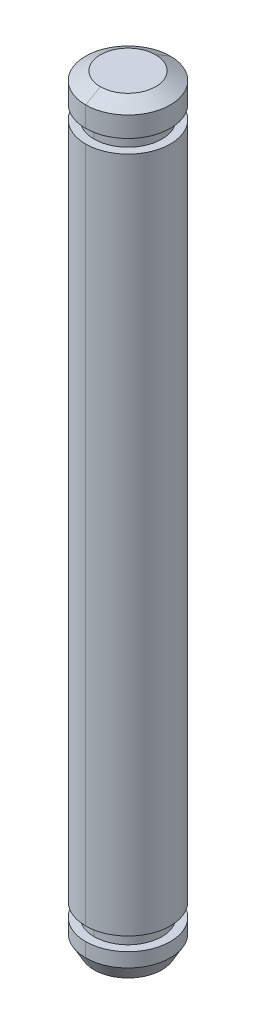
ISO-10303-21;
HEADER;
FILE_DESCRIPTION(('STEP AP214'),'2;1');
FILE_NAME('part.step','',(''),(''),'','','');
FILE_SCHEMA(('AUTOMOTIVE_DESIGN { 1 0 10303 214 1 1 1 1 }'));
ENDSEC;
DATA;
#1=APPLICATION_CONTEXT('core data for automotive mechanical design processes');
#2=APPLICATION_PROTOCOL_DEFINITION('international standard','automotive_design',2000,#1);
#3=PRODUCT_CONTEXT('',#1,'mechanical');
#4=PRODUCT('Part','Part','',(#3));
#5=PRODUCT_RELATED_PRODUCT_CATEGORY('part','',(#4));
#6=PRODUCT_DEFINITION_FORMATION('','',#4);
#7=PRODUCT_DEFINITION_CONTEXT('part definition',#1,'design');
#8=PRODUCT_DEFINITION('design','',#6,#7);
#9=PRODUCT_DEFINITION_SHAPE('','',#8);
#10=(LENGTH_UNIT() NAMED_UNIT(*) SI_UNIT(.MILLI.,.METRE.));
#11=(NAMED_UNIT(*) PLANE_ANGLE_UNIT() SI_UNIT($,.RADIAN.));
#12=(NAMED_UNIT(*) SI_UNIT($,.STERADIAN.) SOLID_ANGLE_UNIT());
#13=UNCERTAINTY_MEASURE_WITH_UNIT(LENGTH_MEASURE(1.E-05),#10,'distance_accuracy_value','');
#14=(GEOMETRIC_REPRESENTATION_CONTEXT(3) GLOBAL_UNCERTAINTY_ASSIGNED_CONTEXT((#13)) GLOBAL_UNIT_ASSIGNED_CONTEXT((#10,
#11,#12)) REPRESENTATION_CONTEXT('',''));
#15=CARTESIAN_POINT('',(0.,0.,0.));
#16=DIRECTION('',(0.,0.,1.));
#17=DIRECTION('',(1.,0.,0.));
#18=AXIS2_PLACEMENT_3D('',#15,#16,#17);
#19=CARTESIAN_POINT('',(0.,-21.6339745962154,0.));
#20=DIRECTION('',(0.,1.,0.));
#21=DIRECTION('',(0.,0.,1.));
#22=AXIS2_PLACEMENT_3D('',#19,#20,#21);
#23=CONICAL_SURFACE('',#22,2.5,0.523598775598306);
#24=DIRECTION('',(0.,0.866025403784435,-0.500000000000006));
#25=VECTOR('',#24,1.);
#26=CARTESIAN_POINT('',(0.,-21.6339745962154,-2.5));
#27=LINE('',#26,#25);
#28=CARTESIAN_POINT('',(0.,-22.5,-1.99999999999992));
#29=VERTEX_POINT('',#28);
#30=CARTESIAN_POINT('',(0.,-21.6339745962154,-2.5));
#31=VERTEX_POINT('',#30);
#32=EDGE_CURVE('E222',#29,#31,#27,.T.);
#33=ORIENTED_EDGE('',*,*,#32,.F.);
#34=CARTESIAN_POINT('',(0.,-22.5,0.));
#35=DIRECTION('',(0.,-1.,0.));
#36=DIRECTION('',(0.,0.,-1.));
#37=AXIS2_PLACEMENT_3D('',#34,#35,#36);
#38=CIRCLE('',#37,1.99999999999992);
#39=CARTESIAN_POINT('',(0.,-22.5,1.99999999999992));
#40=VERTEX_POINT('',#39);
#41=EDGE_CURVE('E28',#40,#29,#38,.T.);
#42=ORIENTED_EDGE('',*,*,#41,.F.);
#43=DIRECTION('',(0.,0.866025403784435,0.500000000000006));
#44=VECTOR('',#43,1.);
#45=CARTESIAN_POINT('',(0.,-21.6339745962154,2.5));
#46=LINE('',#45,#44);
#47=CARTESIAN_POINT('',(0.,-21.6339745962154,2.5));
#48=VERTEX_POINT('',#47);
#49=EDGE_CURVE('E181',#40,#48,#46,.T.);
#50=ORIENTED_EDGE('',*,*,#49,.T.);
#51=CARTESIAN_POINT('',(0.,-21.6339745962154,0.));
#52=DIRECTION('',(0.,1.,0.));
#53=DIRECTION('',(0.,0.,-1.));
#54=AXIS2_PLACEMENT_3D('',#51,#52,#53);
#55=CIRCLE('',#54,2.5);
#56=EDGE_CURVE('E11',#31,#48,#55,.T.);
#57=ORIENTED_EDGE('',*,*,#56,.F.);
#58=EDGE_LOOP('',(#33,#42,#50,#57));
#59=FACE_BOUND('',#58,.T.);
#60=ADVANCED_FACE('F17',(#59),#23,.T.);
#61=CARTESIAN_POINT('',(0.,22.5,0.));
#62=DIRECTION('',(0.,-1.,0.));
#63=DIRECTION('',(0.,0.,-1.));
#64=AXIS2_PLACEMENT_3D('',#61,#62,#63);
#65=CONICAL_SURFACE('',#64,1.63397459621556,1.0471975511966);
#66=DIRECTION('',(0.,-0.5,0.866025403784437));
#67=VECTOR('',#66,1.);
#68=CARTESIAN_POINT('',(0.,22.5,1.63397459621556));
#69=LINE('',#68,#67);
#70=CARTESIAN_POINT('',(0.,22.5,1.63397459621556));
#71=VERTEX_POINT('',#70);
#72=CARTESIAN_POINT('',(0.,22.,2.5));
#73=VERTEX_POINT('',#72);
#74=EDGE_CURVE('E143',#71,#73,#69,.T.);
#75=ORIENTED_EDGE('',*,*,#74,.F.);
#76=CARTESIAN_POINT('',(0.,22.5,0.));
#77=DIRECTION('',(0.,1.,0.));
#78=DIRECTION('',(0.,0.,1.));
#79=AXIS2_PLACEMENT_3D('',#76,#77,#78);
#80=CIRCLE('',#79,1.63397459621556);
#81=CARTESIAN_POINT('',(0.,22.5,-1.63397459621556));
#82=VERTEX_POINT('',#81);
#83=EDGE_CURVE('E230',#82,#71,#80,.T.);
#84=ORIENTED_EDGE('',*,*,#83,.F.);
#85=DIRECTION('',(0.,-0.5,-0.866025403784437));
#86=VECTOR('',#85,1.);
#87=CARTESIAN_POINT('',(0.,22.5,-1.63397459621556));
#88=LINE('',#87,#86);
#89=CARTESIAN_POINT('',(0.,22.,-2.5));
#90=VERTEX_POINT('',#89);
#91=EDGE_CURVE('E146',#82,#90,#88,.T.);
#92=ORIENTED_EDGE('',*,*,#91,.T.);
#93=CARTESIAN_POINT('',(0.,22.,0.));
#94=DIRECTION('',(0.,-1.,0.));
#95=DIRECTION('',(0.,0.,1.));
#96=AXIS2_PLACEMENT_3D('',#93,#94,#95);
#97=CIRCLE('',#96,2.5);
#98=EDGE_CURVE('E139',#73,#90,#97,.T.);
#99=ORIENTED_EDGE('',*,*,#98,.F.);
#100=EDGE_LOOP('',(#75,#84,#92,#99));
#101=FACE_BOUND('',#100,.T.);
#102=ADVANCED_FACE('F141',(#101),#65,.T.);
#103=CARTESIAN_POINT('',(0.,22.5,0.));
#104=DIRECTION('',(0.,-1.,0.));
#105=DIRECTION('',(0.,0.,-1.));
#106=AXIS2_PLACEMENT_3D('',#103,#104,#105);
#107=CYLINDRICAL_SURFACE('',#106,2.5);
#108=DIRECTION('',(0.,-1.,0.));
#109=VECTOR('',#108,1.);
#110=CARTESIAN_POINT('',(0.,22.5,2.5));
#111=LINE('',#110,#109);
#112=CARTESIAN_POINT('',(0.,-20.8,2.5));
#113=VERTEX_POINT('',#112);
#114=EDGE_CURVE('E208',#113,#48,#111,.T.);
#115=ORIENTED_EDGE('',*,*,#114,.F.);
#116=CARTESIAN_POINT('',(0.,-20.8,0.));
#117=DIRECTION('',(0.,1.,0.));
#118=DIRECTION('',(0.,0.,1.));
#119=AXIS2_PLACEMENT_3D('',#116,#117,#118);
#120=CIRCLE('',#119,2.5);
#121=CARTESIAN_POINT('',(0.,-20.8,-2.5));
#122=VERTEX_POINT('',#121);
#123=EDGE_CURVE('E233',#122,#113,#120,.T.);
#124=ORIENTED_EDGE('',*,*,#123,.F.);
#125=DIRECTION('',(0.,-1.,0.));
#126=VECTOR('',#125,1.);
#127=CARTESIAN_POINT('',(0.,22.5,-2.5));
#128=LINE('',#127,#126);
#129=EDGE_CURVE('E216',#122,#31,#128,.T.);
#130=ORIENTED_EDGE('',*,*,#129,.T.);
#131=ORIENTED_EDGE('',*,*,#56,.T.);
#132=EDGE_LOOP('',(#115,#124,#130,#131));
#133=FACE_BOUND('',#132,.T.);
#134=ADVANCED_FACE('F335',(#133),#107,.T.);
#135=CARTESIAN_POINT('',(0.,-22.5,0.));
#136=DIRECTION('',(0.,-1.,0.));
#137=DIRECTION('',(0.,0.,-1.));
#138=AXIS2_PLACEMENT_3D('',#135,#136,#137);
#139=PLANE('',#138);
#140=ORIENTED_EDGE('',*,*,#41,.T.);
#141=CARTESIAN_POINT('',(0.,-22.5,0.));
#142=DIRECTION('',(0.,-1.,0.));
#143=DIRECTION('',(0.,0.,-1.));
#144=AXIS2_PLACEMENT_3D('',#141,#142,#143);
#145=CIRCLE('',#144,1.99999999999992);
#146=EDGE_CURVE('E227',#29,#40,#145,.T.);
#147=ORIENTED_EDGE('',*,*,#146,.T.);
#148=EDGE_LOOP('',(#140,#147));
#149=FACE_BOUND('',#148,.T.);
#150=ADVANCED_FACE('F363',(#149),#139,.T.);
#151=CARTESIAN_POINT('',(0.,-20.8,0.));
#152=DIRECTION('',(0.,1.,0.));
#153=DIRECTION('',(0.,0.,1.));
#154=AXIS2_PLACEMENT_3D('',#151,#152,#153);
#155=CYLINDRICAL_SURFACE('',#154,2.);
#156=DIRECTION('',(0.,1.,0.));
#157=VECTOR('',#156,1.);
#158=CARTESIAN_POINT('',(0.,-20.8,-2.));
#159=LINE('',#158,#157);
#160=CARTESIAN_POINT('',(0.,-20.8,-2.));
#161=VERTEX_POINT('',#160);
#162=CARTESIAN_POINT('',(0.,-20.,-2.));
#163=VERTEX_POINT('',#162);
#164=EDGE_CURVE('E280',#161,#163,#159,.T.);
#165=ORIENTED_EDGE('',*,*,#164,.F.);
#166=CARTESIAN_POINT('',(0.,-20.8,0.));
#167=DIRECTION('',(0.,1.,0.));
#168=DIRECTION('',(0.,0.,1.));
#169=AXIS2_PLACEMENT_3D('',#166,#167,#168);
#170=CIRCLE('',#169,2.);
#171=CARTESIAN_POINT('',(0.,-20.8,2.));
#172=VERTEX_POINT('',#171);
#173=EDGE_CURVE('E237',#161,#172,#170,.T.);
#174=ORIENTED_EDGE('',*,*,#173,.T.);
#175=DIRECTION('',(0.,1.,0.));
#176=VECTOR('',#175,1.);
#177=CARTESIAN_POINT('',(0.,-20.8,2.));
#178=LINE('',#177,#176);
#179=CARTESIAN_POINT('',(0.,-20.,2.));
#180=VERTEX_POINT('',#179);
#181=EDGE_CURVE('E300',#172,#180,#178,.T.);
#182=ORIENTED_EDGE('',*,*,#181,.T.);
#183=CARTESIAN_POINT('',(0.,-20.,0.));
#184=DIRECTION('',(0.,1.,0.));
#185=DIRECTION('',(0.,0.,1.));
#186=AXIS2_PLACEMENT_3D('',#183,#184,#185);
#187=CIRCLE('',#186,2.);
#188=EDGE_CURVE('E275',#163,#180,#187,.T.);
#189=ORIENTED_EDGE('',*,*,#188,.F.);
#190=EDGE_LOOP('',(#165,#174,#182,#189));
#191=FACE_BOUND('',#190,.T.);
#192=ADVANCED_FACE('F344',(#191),#155,.T.);
#193=CARTESIAN_POINT('',(0.,-20.,0.));
#194=DIRECTION('',(0.,-1.,0.));
#195=DIRECTION('',(0.,0.,-1.));
#196=AXIS2_PLACEMENT_3D('',#193,#194,#195);
#197=PLANE('',#196);
#198=CARTESIAN_POINT('',(0.,-20.,0.));
#199=DIRECTION('',(0.,1.,0.));
#200=DIRECTION('',(0.,0.,1.));
#201=AXIS2_PLACEMENT_3D('',#198,#199,#200);
#202=CIRCLE('',#201,2.);
#203=EDGE_CURVE('E284',#180,#163,#202,.T.);
#204=ORIENTED_EDGE('',*,*,#203,.T.);
#205=ORIENTED_EDGE('',*,*,#188,.T.);
#206=EDGE_LOOP('',(#204,#205));
#207=FACE_BOUND('',#206,.T.);
#208=CARTESIAN_POINT('',(0.,-20.,0.));
#209=DIRECTION('',(0.,1.,0.));
#210=DIRECTION('',(0.,0.,1.));
#211=AXIS2_PLACEMENT_3D('',#208,#209,#210);
#212=CIRCLE('',#211,2.5);
#213=CARTESIAN_POINT('',(0.,-20.,-2.5));
#214=VERTEX_POINT('',#213);
#215=CARTESIAN_POINT('',(0.,-20.,2.5));
#216=VERTEX_POINT('',#215);
#217=EDGE_CURVE('E42',#214,#216,#212,.T.);
#218=ORIENTED_EDGE('',*,*,#217,.F.);
#219=CARTESIAN_POINT('',(0.,-20.,0.));
#220=DIRECTION('',(0.,1.,0.));
#221=DIRECTION('',(0.,0.,1.));
#222=AXIS2_PLACEMENT_3D('',#219,#220,#221);
#223=CIRCLE('',#222,2.5);
#224=EDGE_CURVE('E195',#216,#214,#223,.T.);
#225=ORIENTED_EDGE('',*,*,#224,.F.);
#226=EDGE_LOOP('',(#218,#225));
#227=FACE_BOUND('',#226,.T.);
#228=ADVANCED_FACE('F337',(#207,#227),#197,.T.);
#229=CARTESIAN_POINT('',(0.,-20.8,0.));
#230=DIRECTION('',(0.,-1.,0.));
#231=DIRECTION('',(0.,0.,-1.));
#232=AXIS2_PLACEMENT_3D('',#229,#230,#231);
#233=PLANE('',#232);
#234=CARTESIAN_POINT('',(0.,-20.8,0.));
#235=DIRECTION('',(0.,1.,0.));
#236=DIRECTION('',(0.,0.,1.));
#237=AXIS2_PLACEMENT_3D('',#234,#235,#236);
#238=CIRCLE('',#237,2.);
#239=EDGE_CURVE('E276',#172,#161,#238,.T.);
#240=ORIENTED_EDGE('',*,*,#239,.F.);
#241=ORIENTED_EDGE('',*,*,#173,.F.);
#242=EDGE_LOOP('',(#240,#241));
#243=FACE_BOUND('',#242,.T.);
#244=ORIENTED_EDGE('',*,*,#123,.T.);
#245=CARTESIAN_POINT('',(0.,-20.8,0.));
#246=DIRECTION('',(0.,1.,0.));
#247=DIRECTION('',(0.,0.,1.));
#248=AXIS2_PLACEMENT_3D('',#245,#246,#247);
#249=CIRCLE('',#248,2.5);
#250=EDGE_CURVE('E203',#113,#122,#249,.T.);
#251=ORIENTED_EDGE('',*,*,#250,.T.);
#252=EDGE_LOOP('',(#244,#251));
#253=FACE_BOUND('',#252,.T.);
#254=ADVANCED_FACE('F19',(#243,#253),#233,.F.);
#255=CARTESIAN_POINT('',(0.,20.8,0.));
#256=DIRECTION('',(0.,-1.,0.));
#257=DIRECTION('',(0.,0.,-1.));
#258=AXIS2_PLACEMENT_3D('',#255,#256,#257);
#259=CYLINDRICAL_SURFACE('',#258,2.);
#260=DIRECTION('',(0.,-1.,0.));
#261=VECTOR('',#260,1.);
#262=CARTESIAN_POINT('',(0.,20.8,2.));
#263=LINE('',#262,#261);
#264=CARTESIAN_POINT('',(0.,20.8,2.));
#265=VERTEX_POINT('',#264);
#266=CARTESIAN_POINT('',(0.,20.,2.));
#267=VERTEX_POINT('',#266);
#268=EDGE_CURVE('E196',#265,#267,#263,.T.);
#269=ORIENTED_EDGE('',*,*,#268,.F.);
#270=CARTESIAN_POINT('',(0.,20.8,0.));
#271=DIRECTION('',(0.,1.,0.));
#272=DIRECTION('',(0.,0.,1.));
#273=AXIS2_PLACEMENT_3D('',#270,#271,#272);
#274=CIRCLE('',#273,2.);
#275=CARTESIAN_POINT('',(0.,20.8,-2.));
#276=VERTEX_POINT('',#275);
#277=EDGE_CURVE('E105',#276,#265,#274,.T.);
#278=ORIENTED_EDGE('',*,*,#277,.F.);
#279=DIRECTION('',(0.,-1.,0.));
#280=VECTOR('',#279,1.);
#281=CARTESIAN_POINT('',(0.,20.8,-2.));
#282=LINE('',#281,#280);
#283=CARTESIAN_POINT('',(0.,20.,-2.));
#284=VERTEX_POINT('',#283);
#285=EDGE_CURVE('E164',#276,#284,#282,.T.);
#286=ORIENTED_EDGE('',*,*,#285,.T.);
#287=CARTESIAN_POINT('',(0.,20.,0.));
#288=DIRECTION('',(0.,1.,0.));
#289=DIRECTION('',(0.,0.,1.));
#290=AXIS2_PLACEMENT_3D('',#287,#288,#289);
#291=CIRCLE('',#290,2.);
#292=EDGE_CURVE('E115',#284,#267,#291,.T.);
#293=ORIENTED_EDGE('',*,*,#292,.T.);
#294=EDGE_LOOP('',(#269,#278,#286,#293));
#295=FACE_BOUND('',#294,.T.);
#296=ADVANCED_FACE('F254',(#295),#259,.T.);
#297=CARTESIAN_POINT('',(0.,20.,0.));
#298=DIRECTION('',(0.,1.,0.));
#299=DIRECTION('',(1.,0.,0.));
#300=AXIS2_PLACEMENT_3D('',#297,#298,#299);
#301=PLANE('',#300);
#302=ORIENTED_EDGE('',*,*,#292,.F.);
#303=CARTESIAN_POINT('',(0.,20.,0.));
#304=DIRECTION('',(0.,1.,0.));
#305=DIRECTION('',(0.,0.,1.));
#306=AXIS2_PLACEMENT_3D('',#303,#304,#305);
#307=CIRCLE('',#306,2.);
#308=EDGE_CURVE('E21',#267,#284,#307,.T.);
#309=ORIENTED_EDGE('',*,*,#308,.F.);
#310=EDGE_LOOP('',(#302,#309));
#311=FACE_BOUND('',#310,.T.);
#312=CARTESIAN_POINT('',(0.,20.,0.));
#313=DIRECTION('',(0.,1.,0.));
#314=DIRECTION('',(0.,0.,1.));
#315=AXIS2_PLACEMENT_3D('',#312,#313,#314);
#316=CIRCLE('',#315,2.5);
#317=CARTESIAN_POINT('',(0.,20.,-2.5));
#318=VERTEX_POINT('',#317);
#319=CARTESIAN_POINT('',(0.,20.,2.5));
#320=VERTEX_POINT('',#319);
#321=EDGE_CURVE('E194',#318,#320,#316,.T.);
#322=ORIENTED_EDGE('',*,*,#321,.T.);
#323=CARTESIAN_POINT('',(0.,20.,0.));
#324=DIRECTION('',(0.,1.,0.));
#325=DIRECTION('',(0.,0.,1.));
#326=AXIS2_PLACEMENT_3D('',#323,#324,#325);
#327=CIRCLE('',#326,2.5);
#328=EDGE_CURVE('E186',#320,#318,#327,.T.);
#329=ORIENTED_EDGE('',*,*,#328,.T.);
#330=EDGE_LOOP('',(#322,#329));
#331=FACE_BOUND('',#330,.T.);
#332=ADVANCED_FACE('F250',(#311,#331),#301,.T.);
#333=CARTESIAN_POINT('',(0.,20.8,0.));
#334=DIRECTION('',(0.,1.,0.));
#335=DIRECTION('',(1.,0.,0.));
#336=AXIS2_PLACEMENT_3D('',#333,#334,#335);
#337=PLANE('',#336);
#338=ORIENTED_EDGE('',*,*,#277,.T.);
#339=CARTESIAN_POINT('',(0.,20.8,0.));
#340=DIRECTION('',(0.,1.,0.));
#341=DIRECTION('',(0.,0.,1.));
#342=AXIS2_PLACEMENT_3D('',#339,#340,#341);
#343=CIRCLE('',#342,2.);
#344=EDGE_CURVE('E200',#265,#276,#343,.T.);
#345=ORIENTED_EDGE('',*,*,#344,.T.);
#346=EDGE_LOOP('',(#338,#345));
#347=FACE_BOUND('',#346,.T.);
#348=CARTESIAN_POINT('',(0.,20.8,0.));
#349=DIRECTION('',(0.,1.,0.));
#350=DIRECTION('',(0.,0.,1.));
#351=AXIS2_PLACEMENT_3D('',#348,#349,#350);
#352=CIRCLE('',#351,2.5);
#353=CARTESIAN_POINT('',(0.,20.8,-2.5));
#354=VERTEX_POINT('',#353);
#355=CARTESIAN_POINT('',(0.,20.8,2.5));
#356=VERTEX_POINT('',#355);
#357=EDGE_CURVE('E152',#354,#356,#352,.T.);
#358=ORIENTED_EDGE('',*,*,#357,.F.);
#359=CARTESIAN_POINT('',(0.,20.8,0.));
#360=DIRECTION('',(0.,1.,0.));
#361=DIRECTION('',(0.,0.,1.));
#362=AXIS2_PLACEMENT_3D('',#359,#360,#361);
#363=CIRCLE('',#362,2.5);
#364=EDGE_CURVE('E163',#356,#354,#363,.T.);
#365=ORIENTED_EDGE('',*,*,#364,.F.);
#366=EDGE_LOOP('',(#358,#365));
#367=FACE_BOUND('',#366,.T.);
#368=ADVANCED_FACE('F253',(#347,#367),#337,.F.);
#369=CARTESIAN_POINT('',(0.,22.5,0.));
#370=DIRECTION('',(0.,1.,0.));
#371=DIRECTION('',(1.,0.,0.));
#372=AXIS2_PLACEMENT_3D('',#369,#370,#371);
#373=PLANE('',#372);
#374=ORIENTED_EDGE('',*,*,#83,.T.);
#375=CARTESIAN_POINT('',(0.,22.5,0.));
#376=DIRECTION('',(0.,1.,0.));
#377=DIRECTION('',(0.,0.,1.));
#378=AXIS2_PLACEMENT_3D('',#375,#376,#377);
#379=CIRCLE('',#378,1.63397459621556);
#380=EDGE_CURVE('E174',#71,#82,#379,.T.);
#381=ORIENTED_EDGE('',*,*,#380,.T.);
#382=EDGE_LOOP('',(#374,#381));
#383=FACE_BOUND('',#382,.T.);
#384=ADVANCED_FACE('F369',(#383),#373,.T.);
#385=CARTESIAN_POINT('',(0.,22.5,0.));
#386=DIRECTION('',(0.,-1.,0.));
#387=DIRECTION('',(0.,0.,-1.));
#388=AXIS2_PLACEMENT_3D('',#385,#386,#387);
#389=CYLINDRICAL_SURFACE('',#388,2.5);
#390=DIRECTION('',(0.,-1.,0.));
#391=VECTOR('',#390,1.);
#392=CARTESIAN_POINT('',(0.,22.5,2.5));
#393=LINE('',#392,#391);
#394=EDGE_CURVE('E155',#73,#356,#393,.T.);
#395=ORIENTED_EDGE('',*,*,#394,.F.);
#396=ORIENTED_EDGE('',*,*,#98,.T.);
#397=DIRECTION('',(0.,-1.,0.));
#398=VECTOR('',#397,1.);
#399=CARTESIAN_POINT('',(0.,22.5,-2.5));
#400=LINE('',#399,#398);
#401=EDGE_CURVE('E168',#90,#354,#400,.T.);
#402=ORIENTED_EDGE('',*,*,#401,.T.);
#403=ORIENTED_EDGE('',*,*,#357,.T.);
#404=EDGE_LOOP('',(#395,#396,#402,#403));
#405=FACE_BOUND('',#404,.T.);
#406=ADVANCED_FACE('F157',(#405),#389,.T.);
#407=CARTESIAN_POINT('',(0.,22.5,0.));
#408=DIRECTION('',(0.,-1.,0.));
#409=DIRECTION('',(0.,0.,-1.));
#410=AXIS2_PLACEMENT_3D('',#407,#408,#409);
#411=CYLINDRICAL_SURFACE('',#410,2.5);
#412=DIRECTION('',(0.,-1.,0.));
#413=VECTOR('',#412,1.);
#414=CARTESIAN_POINT('',(0.,22.5,2.5));
#415=LINE('',#414,#413);
#416=EDGE_CURVE('E190',#320,#216,#415,.T.);
#417=ORIENTED_EDGE('',*,*,#416,.F.);
#418=ORIENTED_EDGE('',*,*,#321,.F.);
#419=DIRECTION('',(0.,-1.,0.));
#420=VECTOR('',#419,1.);
#421=CARTESIAN_POINT('',(0.,22.5,-2.5));
#422=LINE('',#421,#420);
#423=EDGE_CURVE('E191',#318,#214,#422,.T.);
#424=ORIENTED_EDGE('',*,*,#423,.T.);
#425=ORIENTED_EDGE('',*,*,#217,.T.);
#426=EDGE_LOOP('',(#417,#418,#424,#425));
#427=FACE_BOUND('',#426,.T.);
#428=ADVANCED_FACE('F261',(#427),#411,.T.);
#429=CARTESIAN_POINT('',(0.,22.5,0.));
#430=DIRECTION('',(0.,-1.,0.));
#431=DIRECTION('',(0.,0.,-1.));
#432=AXIS2_PLACEMENT_3D('',#429,#430,#431);
#433=CYLINDRICAL_SURFACE('',#432,2.5);
#434=ORIENTED_EDGE('',*,*,#328,.F.);
#435=ORIENTED_EDGE('',*,*,#416,.T.);
#436=ORIENTED_EDGE('',*,*,#224,.T.);
#437=ORIENTED_EDGE('',*,*,#423,.F.);
#438=EDGE_LOOP('',(#434,#435,#436,#437));
#439=FACE_BOUND('',#438,.T.);
#440=ADVANCED_FACE('F266',(#439),#433,.T.);
#441=CARTESIAN_POINT('',(0.,22.5,0.));
#442=DIRECTION('',(0.,-1.,0.));
#443=DIRECTION('',(0.,0.,-1.));
#444=AXIS2_PLACEMENT_3D('',#441,#442,#443);
#445=CYLINDRICAL_SURFACE('',#444,2.5);
#446=CARTESIAN_POINT('',(0.,22.,0.));
#447=DIRECTION('',(0.,-1.,0.));
#448=DIRECTION('',(0.,0.,1.));
#449=AXIS2_PLACEMENT_3D('',#446,#447,#448);
#450=CIRCLE('',#449,2.5);
#451=EDGE_CURVE('E166',#90,#73,#450,.T.);
#452=ORIENTED_EDGE('',*,*,#451,.T.);
#453=ORIENTED_EDGE('',*,*,#394,.T.);
#454=ORIENTED_EDGE('',*,*,#364,.T.);
#455=ORIENTED_EDGE('',*,*,#401,.F.);
#456=EDGE_LOOP('',(#452,#453,#454,#455));
#457=FACE_BOUND('',#456,.T.);
#458=ADVANCED_FACE('F167',(#457),#445,.T.);
#459=CARTESIAN_POINT('',(0.,20.8,0.));
#460=DIRECTION('',(0.,-1.,0.));
#461=DIRECTION('',(0.,0.,-1.));
#462=AXIS2_PLACEMENT_3D('',#459,#460,#461);
#463=CYLINDRICAL_SURFACE('',#462,2.);
#464=ORIENTED_EDGE('',*,*,#344,.F.);
#465=ORIENTED_EDGE('',*,*,#268,.T.);
#466=ORIENTED_EDGE('',*,*,#308,.T.);
#467=ORIENTED_EDGE('',*,*,#285,.F.);
#468=EDGE_LOOP('',(#464,#465,#466,#467));
#469=FACE_BOUND('',#468,.T.);
#470=ADVANCED_FACE('F247',(#469),#463,.T.);
#471=CARTESIAN_POINT('',(0.,-20.8,0.));
#472=DIRECTION('',(0.,1.,0.));
#473=DIRECTION('',(0.,0.,1.));
#474=AXIS2_PLACEMENT_3D('',#471,#472,#473);
#475=CYLINDRICAL_SURFACE('',#474,2.);
#476=ORIENTED_EDGE('',*,*,#239,.T.);
#477=ORIENTED_EDGE('',*,*,#164,.T.);
#478=ORIENTED_EDGE('',*,*,#203,.F.);
#479=ORIENTED_EDGE('',*,*,#181,.F.);
#480=EDGE_LOOP('',(#476,#477,#478,#479));
#481=FACE_BOUND('',#480,.T.);
#482=ADVANCED_FACE('F359',(#481),#475,.T.);
#483=CARTESIAN_POINT('',(0.,22.5,0.));
#484=DIRECTION('',(0.,-1.,0.));
#485=DIRECTION('',(0.,0.,-1.));
#486=AXIS2_PLACEMENT_3D('',#483,#484,#485);
#487=CYLINDRICAL_SURFACE('',#486,2.5);
#488=ORIENTED_EDGE('',*,*,#250,.F.);
#489=ORIENTED_EDGE('',*,*,#114,.T.);
#490=CARTESIAN_POINT('',(0.,-21.6339745962154,0.));
#491=DIRECTION('',(0.,1.,0.));
#492=DIRECTION('',(0.,0.,-1.));
#493=AXIS2_PLACEMENT_3D('',#490,#491,#492);
#494=CIRCLE('',#493,2.5);
#495=EDGE_CURVE('E226',#48,#31,#494,.T.);
#496=ORIENTED_EDGE('',*,*,#495,.T.);
#497=ORIENTED_EDGE('',*,*,#129,.F.);
#498=EDGE_LOOP('',(#488,#489,#496,#497));
#499=FACE_BOUND('',#498,.T.);
#500=ADVANCED_FACE('F331',(#499),#487,.T.);
#501=CARTESIAN_POINT('',(0.,22.5,0.));
#502=DIRECTION('',(0.,-1.,0.));
#503=DIRECTION('',(0.,0.,-1.));
#504=AXIS2_PLACEMENT_3D('',#501,#502,#503);
#505=CONICAL_SURFACE('',#504,1.63397459621556,1.0471975511966);
#506=ORIENTED_EDGE('',*,*,#380,.F.);
#507=ORIENTED_EDGE('',*,*,#74,.T.);
#508=ORIENTED_EDGE('',*,*,#451,.F.);
#509=ORIENTED_EDGE('',*,*,#91,.F.);
#510=EDGE_LOOP('',(#506,#507,#508,#509));
#511=FACE_BOUND('',#510,.T.);
#512=ADVANCED_FACE('F172',(#511),#505,.T.);
#513=CARTESIAN_POINT('',(0.,-21.6339745962154,0.));
#514=DIRECTION('',(0.,1.,0.));
#515=DIRECTION('',(0.,0.,1.));
#516=AXIS2_PLACEMENT_3D('',#513,#514,#515);
#517=CONICAL_SURFACE('',#516,2.5,0.523598775598306);
#518=ORIENTED_EDGE('',*,*,#146,.F.);
#519=ORIENTED_EDGE('',*,*,#32,.T.);
#520=ORIENTED_EDGE('',*,*,#495,.F.);
#521=ORIENTED_EDGE('',*,*,#49,.F.);
#522=EDGE_LOOP('',(#518,#519,#520,#521));
#523=FACE_BOUND('',#522,.T.);
#524=ADVANCED_FACE('F328',(#523),#517,.T.);
#525=CLOSED_SHELL('',(#60,#102,#134,#150,#192,#228,#254,#296,#332,#368,#384,#406,#428,#440,#458,
#470,#482,#500,#512,#524));
#526=MANIFOLD_SOLID_BREP('B1',#525);
#527=ADVANCED_BREP_SHAPE_REPRESENTATION('',(#18,#526),#14);
#528=SHAPE_DEFINITION_REPRESENTATION(#9,#527);
ENDSEC;
END-ISO-10303-21;
